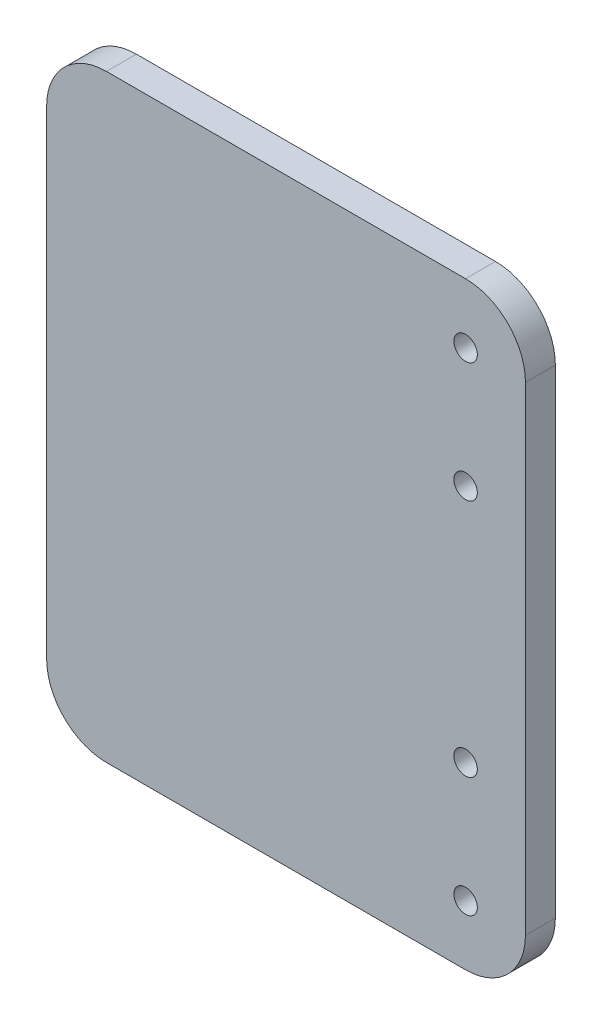
ISO-10303-21;
HEADER;
FILE_DESCRIPTION(('STEP AP214'),'2;1');
FILE_NAME('part.step','',(''),(''),'','','');
FILE_SCHEMA(('AUTOMOTIVE_DESIGN { 1 0 10303 214 1 1 1 1 }'));
ENDSEC;
DATA;
#1=APPLICATION_CONTEXT('core data for automotive mechanical design processes');
#2=APPLICATION_PROTOCOL_DEFINITION('international standard','automotive_design',2000,#1);
#3=PRODUCT_CONTEXT('',#1,'mechanical');
#4=PRODUCT('Part','Part','',(#3));
#5=PRODUCT_RELATED_PRODUCT_CATEGORY('part','',(#4));
#6=PRODUCT_DEFINITION_FORMATION('','',#4);
#7=PRODUCT_DEFINITION_CONTEXT('part definition',#1,'design');
#8=PRODUCT_DEFINITION('design','',#6,#7);
#9=PRODUCT_DEFINITION_SHAPE('','',#8);
#10=(LENGTH_UNIT() NAMED_UNIT(*) SI_UNIT(.MILLI.,.METRE.));
#11=(NAMED_UNIT(*) PLANE_ANGLE_UNIT() SI_UNIT($,.RADIAN.));
#12=(NAMED_UNIT(*) SI_UNIT($,.STERADIAN.) SOLID_ANGLE_UNIT());
#13=UNCERTAINTY_MEASURE_WITH_UNIT(LENGTH_MEASURE(1.E-05),#10,'distance_accuracy_value','');
#14=(GEOMETRIC_REPRESENTATION_CONTEXT(3) GLOBAL_UNCERTAINTY_ASSIGNED_CONTEXT((#13)) GLOBAL_UNIT_ASSIGNED_CONTEXT((#10,
#11,#12)) REPRESENTATION_CONTEXT('',''));
#15=CARTESIAN_POINT('',(0.,0.,0.));
#16=DIRECTION('',(0.,0.,1.));
#17=DIRECTION('',(1.,0.,0.));
#18=AXIS2_PLACEMENT_3D('',#15,#16,#17);
#19=CARTESIAN_POINT('',(50.8,63.5,6.35));
#20=DIRECTION('',(0.,-1.,0.));
#21=DIRECTION('',(0.,0.,-1.));
#22=AXIS2_PLACEMENT_3D('',#19,#20,#21);
#23=PLANE('',#22);
#24=DIRECTION('',(-1.,0.,0.));
#25=VECTOR('',#24,1.);
#26=CARTESIAN_POINT('',(50.8,63.5,6.35));
#27=LINE('',#26,#25);
#28=CARTESIAN_POINT('',(38.1,63.5,6.35));
#29=VERTEX_POINT('',#28);
#30=CARTESIAN_POINT('',(-38.1,63.5,6.35));
#31=VERTEX_POINT('',#30);
#32=EDGE_CURVE('E146',#29,#31,#27,.T.);
#33=ORIENTED_EDGE('',*,*,#32,.F.);
#34=DIRECTION('',(0.,0.,-1.));
#35=VECTOR('',#34,1.);
#36=CARTESIAN_POINT('',(38.1,63.5,6.35));
#37=LINE('',#36,#35);
#38=CARTESIAN_POINT('',(38.1,63.5,0.));
#39=VERTEX_POINT('',#38);
#40=EDGE_CURVE('E11',#29,#39,#37,.T.);
#41=ORIENTED_EDGE('',*,*,#40,.T.);
#42=DIRECTION('',(-1.,0.,0.));
#43=VECTOR('',#42,1.);
#44=CARTESIAN_POINT('',(50.8,63.5,0.));
#45=LINE('',#44,#43);
#46=CARTESIAN_POINT('',(-38.1,63.5,0.));
#47=VERTEX_POINT('',#46);
#48=EDGE_CURVE('E148',#39,#47,#45,.T.);
#49=ORIENTED_EDGE('',*,*,#48,.T.);
#50=DIRECTION('',(0.,0.,-1.));
#51=VECTOR('',#50,1.);
#52=CARTESIAN_POINT('',(-38.1,63.5,6.35));
#53=LINE('',#52,#51);
#54=EDGE_CURVE('E54',#47,#31,#53,.F.);
#55=ORIENTED_EDGE('',*,*,#54,.T.);
#56=EDGE_LOOP('',(#33,#41,#49,#55));
#57=FACE_BOUND('',#56,.T.);
#58=ADVANCED_FACE('F45',(#57),#23,.F.);
#59=CARTESIAN_POINT('',(-50.8,-63.5,6.35));
#60=DIRECTION('',(1.,0.,0.));
#61=DIRECTION('',(0.,0.,-1.));
#62=AXIS2_PLACEMENT_3D('',#59,#60,#61);
#63=PLANE('',#62);
#64=DIRECTION('',(0.,-1.,0.));
#65=VECTOR('',#64,1.);
#66=CARTESIAN_POINT('',(-50.8,-63.5,0.));
#67=LINE('',#66,#65);
#68=CARTESIAN_POINT('',(-50.8,50.8,0.));
#69=VERTEX_POINT('',#68);
#70=CARTESIAN_POINT('',(-50.8,-50.8,0.));
#71=VERTEX_POINT('',#70);
#72=EDGE_CURVE('E142',#69,#71,#67,.T.);
#73=ORIENTED_EDGE('',*,*,#72,.T.);
#74=DIRECTION('',(0.,0.,-1.));
#75=VECTOR('',#74,1.);
#76=CARTESIAN_POINT('',(-50.8,-50.8,6.35));
#77=LINE('',#76,#75);
#78=CARTESIAN_POINT('',(-50.8,-50.8,6.35));
#79=VERTEX_POINT('',#78);
#80=EDGE_CURVE('E118',#71,#79,#77,.F.);
#81=ORIENTED_EDGE('',*,*,#80,.T.);
#82=DIRECTION('',(0.,-1.,0.));
#83=VECTOR('',#82,1.);
#84=CARTESIAN_POINT('',(-50.8,-63.5,6.35));
#85=LINE('',#84,#83);
#86=CARTESIAN_POINT('',(-50.8,50.8,6.35));
#87=VERTEX_POINT('',#86);
#88=EDGE_CURVE('E198',#87,#79,#85,.T.);
#89=ORIENTED_EDGE('',*,*,#88,.F.);
#90=DIRECTION('',(0.,0.,-1.));
#91=VECTOR('',#90,1.);
#92=CARTESIAN_POINT('',(-50.8,50.8,6.35));
#93=LINE('',#92,#91);
#94=EDGE_CURVE('E124',#87,#69,#93,.T.);
#95=ORIENTED_EDGE('',*,*,#94,.T.);
#96=EDGE_LOOP('',(#73,#81,#89,#95));
#97=FACE_BOUND('',#96,.T.);
#98=ADVANCED_FACE('F202',(#97),#63,.F.);
#99=CARTESIAN_POINT('',(50.8,-63.5,6.35));
#100=DIRECTION('',(0.,1.,0.));
#101=DIRECTION('',(0.,0.,1.));
#102=AXIS2_PLACEMENT_3D('',#99,#100,#101);
#103=PLANE('',#102);
#104=DIRECTION('',(1.,0.,0.));
#105=VECTOR('',#104,1.);
#106=CARTESIAN_POINT('',(50.8,-63.5,6.35));
#107=LINE('',#106,#105);
#108=CARTESIAN_POINT('',(-38.1,-63.5,6.35));
#109=VERTEX_POINT('',#108);
#110=CARTESIAN_POINT('',(38.1,-63.5,6.35));
#111=VERTEX_POINT('',#110);
#112=EDGE_CURVE('E133',#109,#111,#107,.T.);
#113=ORIENTED_EDGE('',*,*,#112,.F.);
#114=DIRECTION('',(0.,0.,-1.));
#115=VECTOR('',#114,1.);
#116=CARTESIAN_POINT('',(-38.1,-63.5,6.35));
#117=LINE('',#116,#115);
#118=CARTESIAN_POINT('',(-38.1,-63.5,0.));
#119=VERTEX_POINT('',#118);
#120=EDGE_CURVE('E117',#109,#119,#117,.T.);
#121=ORIENTED_EDGE('',*,*,#120,.T.);
#122=DIRECTION('',(1.,0.,0.));
#123=VECTOR('',#122,1.);
#124=CARTESIAN_POINT('',(50.8,-63.5,0.));
#125=LINE('',#124,#123);
#126=CARTESIAN_POINT('',(38.1,-63.5,0.));
#127=VERTEX_POINT('',#126);
#128=EDGE_CURVE('E131',#119,#127,#125,.T.);
#129=ORIENTED_EDGE('',*,*,#128,.T.);
#130=DIRECTION('',(0.,0.,-1.));
#131=VECTOR('',#130,1.);
#132=CARTESIAN_POINT('',(38.1,-63.5,6.35));
#133=LINE('',#132,#131);
#134=EDGE_CURVE('E136',#127,#111,#133,.F.);
#135=ORIENTED_EDGE('',*,*,#134,.T.);
#136=EDGE_LOOP('',(#113,#121,#129,#135));
#137=FACE_BOUND('',#136,.T.);
#138=ADVANCED_FACE('F130',(#137),#103,.F.);
#139=CARTESIAN_POINT('',(50.8,-63.5,6.35));
#140=DIRECTION('',(-1.,0.,0.));
#141=DIRECTION('',(0.,0.,1.));
#142=AXIS2_PLACEMENT_3D('',#139,#140,#141);
#143=PLANE('',#142);
#144=DIRECTION('',(0.,1.,0.));
#145=VECTOR('',#144,1.);
#146=CARTESIAN_POINT('',(50.8,-63.5,6.35));
#147=LINE('',#146,#145);
#148=CARTESIAN_POINT('',(50.8,-50.8,6.35));
#149=VERTEX_POINT('',#148);
#150=CARTESIAN_POINT('',(50.8,50.8,6.35));
#151=VERTEX_POINT('',#150);
#152=EDGE_CURVE('E153',#149,#151,#147,.T.);
#153=ORIENTED_EDGE('',*,*,#152,.F.);
#154=DIRECTION('',(0.,0.,-1.));
#155=VECTOR('',#154,1.);
#156=CARTESIAN_POINT('',(50.8,-50.8,6.35));
#157=LINE('',#156,#155);
#158=CARTESIAN_POINT('',(50.8,-50.8,0.));
#159=VERTEX_POINT('',#158);
#160=EDGE_CURVE('E180',#149,#159,#157,.T.);
#161=ORIENTED_EDGE('',*,*,#160,.T.);
#162=DIRECTION('',(0.,1.,0.));
#163=VECTOR('',#162,1.);
#164=CARTESIAN_POINT('',(50.8,-63.5,0.));
#165=LINE('',#164,#163);
#166=CARTESIAN_POINT('',(50.8,50.8,0.));
#167=VERTEX_POINT('',#166);
#168=EDGE_CURVE('E141',#159,#167,#165,.T.);
#169=ORIENTED_EDGE('',*,*,#168,.T.);
#170=DIRECTION('',(0.,0.,-1.));
#171=VECTOR('',#170,1.);
#172=CARTESIAN_POINT('',(50.8,50.8,6.35));
#173=LINE('',#172,#171);
#174=EDGE_CURVE('E61',#167,#151,#173,.F.);
#175=ORIENTED_EDGE('',*,*,#174,.T.);
#176=EDGE_LOOP('',(#153,#161,#169,#175));
#177=FACE_BOUND('',#176,.T.);
#178=ADVANCED_FACE('F248',(#177),#143,.F.);
#179=CARTESIAN_POINT('',(0.,0.,6.35));
#180=DIRECTION('',(0.,0.,-1.));
#181=DIRECTION('',(-1.,0.,0.));
#182=AXIS2_PLACEMENT_3D('',#179,#180,#181);
#183=PLANE('',#182);
#184=CARTESIAN_POINT('',(38.1,-50.8,6.35));
#185=DIRECTION('',(0.,0.,1.));
#186=DIRECTION('',(1.,0.,0.));
#187=AXIS2_PLACEMENT_3D('',#184,#185,#186);
#188=CIRCLE('',#187,2.48919999999999);
#189=CARTESIAN_POINT('',(40.5892,-50.8,6.35));
#190=VERTEX_POINT('',#189);
#191=EDGE_CURVE('E239',#190,#190,#188,.T.);
#192=ORIENTED_EDGE('',*,*,#191,.F.);
#193=EDGE_LOOP('',(#192));
#194=FACE_BOUND('',#193,.T.);
#195=CARTESIAN_POINT('',(38.1,-25.4,6.35));
#196=DIRECTION('',(0.,0.,1.));
#197=DIRECTION('',(1.,0.,0.));
#198=AXIS2_PLACEMENT_3D('',#195,#196,#197);
#199=CIRCLE('',#198,2.48919999999999);
#200=CARTESIAN_POINT('',(40.5892,-25.4,6.35));
#201=VERTEX_POINT('',#200);
#202=EDGE_CURVE('E231',#201,#201,#199,.T.);
#203=ORIENTED_EDGE('',*,*,#202,.F.);
#204=EDGE_LOOP('',(#203));
#205=FACE_BOUND('',#204,.T.);
#206=CARTESIAN_POINT('',(38.1,25.4,6.35));
#207=DIRECTION('',(0.,0.,1.));
#208=DIRECTION('',(1.,0.,0.));
#209=AXIS2_PLACEMENT_3D('',#206,#207,#208);
#210=CIRCLE('',#209,2.48919999999999);
#211=CARTESIAN_POINT('',(40.5892,25.4,6.35));
#212=VERTEX_POINT('',#211);
#213=EDGE_CURVE('E223',#212,#212,#210,.T.);
#214=ORIENTED_EDGE('',*,*,#213,.F.);
#215=EDGE_LOOP('',(#214));
#216=FACE_BOUND('',#215,.T.);
#217=CARTESIAN_POINT('',(38.1,50.8,6.35));
#218=DIRECTION('',(0.,0.,1.));
#219=DIRECTION('',(1.,0.,0.));
#220=AXIS2_PLACEMENT_3D('',#217,#218,#219);
#221=CIRCLE('',#220,2.48919999999999);
#222=CARTESIAN_POINT('',(40.5892,50.8,6.35));
#223=VERTEX_POINT('',#222);
#224=EDGE_CURVE('E207',#223,#223,#221,.T.);
#225=ORIENTED_EDGE('',*,*,#224,.F.);
#226=EDGE_LOOP('',(#225));
#227=FACE_BOUND('',#226,.T.);
#228=ORIENTED_EDGE('',*,*,#88,.T.);
#229=CARTESIAN_POINT('',(-38.1,-50.8,6.35));
#230=DIRECTION('',(0.,0.,-1.));
#231=DIRECTION('',(-1.,0.,0.));
#232=AXIS2_PLACEMENT_3D('',#229,#230,#231);
#233=CIRCLE('',#232,12.7);
#234=EDGE_CURVE('E175',#79,#109,#233,.F.);
#235=ORIENTED_EDGE('',*,*,#234,.T.);
#236=ORIENTED_EDGE('',*,*,#112,.T.);
#237=CARTESIAN_POINT('',(38.1,-50.8,6.35));
#238=DIRECTION('',(0.,0.,-1.));
#239=DIRECTION('',(-1.,0.,0.));
#240=AXIS2_PLACEMENT_3D('',#237,#238,#239);
#241=CIRCLE('',#240,12.7);
#242=EDGE_CURVE('E68',#111,#149,#241,.F.);
#243=ORIENTED_EDGE('',*,*,#242,.T.);
#244=ORIENTED_EDGE('',*,*,#152,.T.);
#245=CARTESIAN_POINT('',(38.1,50.8,6.35));
#246=DIRECTION('',(0.,0.,-1.));
#247=DIRECTION('',(-1.,0.,0.));
#248=AXIS2_PLACEMENT_3D('',#245,#246,#247);
#249=CIRCLE('',#248,12.7);
#250=EDGE_CURVE('E170',#151,#29,#249,.F.);
#251=ORIENTED_EDGE('',*,*,#250,.T.);
#252=ORIENTED_EDGE('',*,*,#32,.T.);
#253=CARTESIAN_POINT('',(-38.1,50.8,6.35));
#254=DIRECTION('',(0.,0.,-1.));
#255=DIRECTION('',(-1.,0.,0.));
#256=AXIS2_PLACEMENT_3D('',#253,#254,#255);
#257=CIRCLE('',#256,12.7);
#258=EDGE_CURVE('E167',#31,#87,#257,.F.);
#259=ORIENTED_EDGE('',*,*,#258,.T.);
#260=EDGE_LOOP('',(#228,#235,#236,#243,#244,#251,#252,#259));
#261=FACE_BOUND('',#260,.T.);
#262=ADVANCED_FACE('F194',(#194,#205,#216,#227,#261),#183,.F.);
#263=CARTESIAN_POINT('',(0.,0.,0.));
#264=DIRECTION('',(0.,0.,-1.));
#265=DIRECTION('',(-1.,0.,0.));
#266=AXIS2_PLACEMENT_3D('',#263,#264,#265);
#267=PLANE('',#266);
#268=CARTESIAN_POINT('',(38.1,-50.8,0.));
#269=DIRECTION('',(0.,0.,1.));
#270=DIRECTION('',(1.,0.,0.));
#271=AXIS2_PLACEMENT_3D('',#268,#269,#270);
#272=CIRCLE('',#271,2.48919999999999);
#273=CARTESIAN_POINT('',(40.5892,-50.8,0.));
#274=VERTEX_POINT('',#273);
#275=EDGE_CURVE('E235',#274,#274,#272,.T.);
#276=ORIENTED_EDGE('',*,*,#275,.T.);
#277=EDGE_LOOP('',(#276));
#278=FACE_BOUND('',#277,.T.);
#279=CARTESIAN_POINT('',(38.1,-25.4,0.));
#280=DIRECTION('',(0.,0.,1.));
#281=DIRECTION('',(1.,0.,0.));
#282=AXIS2_PLACEMENT_3D('',#279,#280,#281);
#283=CIRCLE('',#282,2.48919999999999);
#284=CARTESIAN_POINT('',(40.5892,-25.4,0.));
#285=VERTEX_POINT('',#284);
#286=EDGE_CURVE('E227',#285,#285,#283,.T.);
#287=ORIENTED_EDGE('',*,*,#286,.T.);
#288=EDGE_LOOP('',(#287));
#289=FACE_BOUND('',#288,.T.);
#290=CARTESIAN_POINT('',(38.1,25.4,0.));
#291=DIRECTION('',(0.,0.,1.));
#292=DIRECTION('',(1.,0.,0.));
#293=AXIS2_PLACEMENT_3D('',#290,#291,#292);
#294=CIRCLE('',#293,2.48919999999999);
#295=CARTESIAN_POINT('',(40.5892,25.4,0.));
#296=VERTEX_POINT('',#295);
#297=EDGE_CURVE('E219',#296,#296,#294,.T.);
#298=ORIENTED_EDGE('',*,*,#297,.T.);
#299=EDGE_LOOP('',(#298));
#300=FACE_BOUND('',#299,.T.);
#301=CARTESIAN_POINT('',(38.1,50.8,0.));
#302=DIRECTION('',(0.,0.,1.));
#303=DIRECTION('',(1.,0.,0.));
#304=AXIS2_PLACEMENT_3D('',#301,#302,#303);
#305=CIRCLE('',#304,2.48919999999999);
#306=CARTESIAN_POINT('',(40.5892,50.8,0.));
#307=VERTEX_POINT('',#306);
#308=EDGE_CURVE('E204',#307,#307,#305,.T.);
#309=ORIENTED_EDGE('',*,*,#308,.T.);
#310=EDGE_LOOP('',(#309));
#311=FACE_BOUND('',#310,.T.);
#312=ORIENTED_EDGE('',*,*,#128,.F.);
#313=CARTESIAN_POINT('',(-38.1,-50.8,0.));
#314=DIRECTION('',(0.,0.,-1.));
#315=DIRECTION('',(-1.,0.,0.));
#316=AXIS2_PLACEMENT_3D('',#313,#314,#315);
#317=CIRCLE('',#316,12.7);
#318=EDGE_CURVE('E113',#119,#71,#317,.T.);
#319=ORIENTED_EDGE('',*,*,#318,.T.);
#320=ORIENTED_EDGE('',*,*,#72,.F.);
#321=CARTESIAN_POINT('',(-38.1,50.8,0.));
#322=DIRECTION('',(0.,0.,-1.));
#323=DIRECTION('',(-1.,0.,0.));
#324=AXIS2_PLACEMENT_3D('',#321,#322,#323);
#325=CIRCLE('',#324,12.7);
#326=EDGE_CURVE('E135',#69,#47,#325,.T.);
#327=ORIENTED_EDGE('',*,*,#326,.T.);
#328=ORIENTED_EDGE('',*,*,#48,.F.);
#329=CARTESIAN_POINT('',(38.1,50.8,0.));
#330=DIRECTION('',(0.,0.,-1.));
#331=DIRECTION('',(-1.,0.,0.));
#332=AXIS2_PLACEMENT_3D('',#329,#330,#331);
#333=CIRCLE('',#332,12.7);
#334=EDGE_CURVE('E157',#39,#167,#333,.T.);
#335=ORIENTED_EDGE('',*,*,#334,.T.);
#336=ORIENTED_EDGE('',*,*,#168,.F.);
#337=CARTESIAN_POINT('',(38.1,-50.8,0.));
#338=DIRECTION('',(0.,0.,-1.));
#339=DIRECTION('',(-1.,0.,0.));
#340=AXIS2_PLACEMENT_3D('',#337,#338,#339);
#341=CIRCLE('',#340,12.7);
#342=EDGE_CURVE('E125',#159,#127,#341,.T.);
#343=ORIENTED_EDGE('',*,*,#342,.T.);
#344=EDGE_LOOP('',(#312,#319,#320,#327,#328,#335,#336,#343));
#345=FACE_BOUND('',#344,.T.);
#346=ADVANCED_FACE('F138',(#278,#289,#300,#311,#345),#267,.T.);
#347=CARTESIAN_POINT('',(38.1,50.8,6.35));
#348=DIRECTION('',(0.,0.,1.));
#349=DIRECTION('',(1.,0.,0.));
#350=AXIS2_PLACEMENT_3D('',#347,#348,#349);
#351=CYLINDRICAL_SURFACE('',#350,2.48919999999999);
#352=ORIENTED_EDGE('',*,*,#308,.F.);
#353=EDGE_LOOP('',(#352));
#354=FACE_BOUND('',#353,.T.);
#355=ORIENTED_EDGE('',*,*,#224,.T.);
#356=EDGE_LOOP('',(#355));
#357=FACE_BOUND('',#356,.T.);
#358=ADVANCED_FACE('F256',(#354,#357),#351,.F.);
#359=CARTESIAN_POINT('',(38.1,25.4,6.35));
#360=DIRECTION('',(0.,0.,1.));
#361=DIRECTION('',(1.,0.,0.));
#362=AXIS2_PLACEMENT_3D('',#359,#360,#361);
#363=CYLINDRICAL_SURFACE('',#362,2.48919999999999);
#364=ORIENTED_EDGE('',*,*,#297,.F.);
#365=EDGE_LOOP('',(#364));
#366=FACE_BOUND('',#365,.T.);
#367=ORIENTED_EDGE('',*,*,#213,.T.);
#368=EDGE_LOOP('',(#367));
#369=FACE_BOUND('',#368,.T.);
#370=ADVANCED_FACE('F258',(#366,#369),#363,.F.);
#371=CARTESIAN_POINT('',(38.1,-25.4,6.35));
#372=DIRECTION('',(0.,0.,1.));
#373=DIRECTION('',(1.,0.,0.));
#374=AXIS2_PLACEMENT_3D('',#371,#372,#373);
#375=CYLINDRICAL_SURFACE('',#374,2.48919999999999);
#376=ORIENTED_EDGE('',*,*,#286,.F.);
#377=EDGE_LOOP('',(#376));
#378=FACE_BOUND('',#377,.T.);
#379=ORIENTED_EDGE('',*,*,#202,.T.);
#380=EDGE_LOOP('',(#379));
#381=FACE_BOUND('',#380,.T.);
#382=ADVANCED_FACE('F264',(#378,#381),#375,.F.);
#383=CARTESIAN_POINT('',(38.1,-50.8,6.35));
#384=DIRECTION('',(0.,0.,1.));
#385=DIRECTION('',(1.,0.,0.));
#386=AXIS2_PLACEMENT_3D('',#383,#384,#385);
#387=CYLINDRICAL_SURFACE('',#386,2.48919999999999);
#388=ORIENTED_EDGE('',*,*,#275,.F.);
#389=EDGE_LOOP('',(#388));
#390=FACE_BOUND('',#389,.T.);
#391=ORIENTED_EDGE('',*,*,#191,.T.);
#392=EDGE_LOOP('',(#391));
#393=FACE_BOUND('',#392,.T.);
#394=ADVANCED_FACE('F244',(#390,#393),#387,.F.);
#395=CARTESIAN_POINT('',(-38.1,-50.8,6.35));
#396=DIRECTION('',(0.,0.,-1.));
#397=DIRECTION('',(-1.,0.,0.));
#398=AXIS2_PLACEMENT_3D('',#395,#396,#397);
#399=CYLINDRICAL_SURFACE('',#398,12.7);
#400=ORIENTED_EDGE('',*,*,#234,.F.);
#401=ORIENTED_EDGE('',*,*,#80,.F.);
#402=ORIENTED_EDGE('',*,*,#318,.F.);
#403=ORIENTED_EDGE('',*,*,#120,.F.);
#404=EDGE_LOOP('',(#400,#401,#402,#403));
#405=FACE_BOUND('',#404,.T.);
#406=ADVANCED_FACE('F116',(#405),#399,.T.);
#407=CARTESIAN_POINT('',(38.1,-50.8,6.35));
#408=DIRECTION('',(0.,0.,-1.));
#409=DIRECTION('',(-1.,0.,0.));
#410=AXIS2_PLACEMENT_3D('',#407,#408,#409);
#411=CYLINDRICAL_SURFACE('',#410,12.7);
#412=ORIENTED_EDGE('',*,*,#242,.F.);
#413=ORIENTED_EDGE('',*,*,#134,.F.);
#414=ORIENTED_EDGE('',*,*,#342,.F.);
#415=ORIENTED_EDGE('',*,*,#160,.F.);
#416=EDGE_LOOP('',(#412,#413,#414,#415));
#417=FACE_BOUND('',#416,.T.);
#418=ADVANCED_FACE('F282',(#417),#411,.T.);
#419=CARTESIAN_POINT('',(38.1,50.8,6.35));
#420=DIRECTION('',(0.,0.,-1.));
#421=DIRECTION('',(-1.,0.,0.));
#422=AXIS2_PLACEMENT_3D('',#419,#420,#421);
#423=CYLINDRICAL_SURFACE('',#422,12.7);
#424=ORIENTED_EDGE('',*,*,#250,.F.);
#425=ORIENTED_EDGE('',*,*,#174,.F.);
#426=ORIENTED_EDGE('',*,*,#334,.F.);
#427=ORIENTED_EDGE('',*,*,#40,.F.);
#428=EDGE_LOOP('',(#424,#425,#426,#427));
#429=FACE_BOUND('',#428,.T.);
#430=ADVANCED_FACE('F284',(#429),#423,.T.);
#431=CARTESIAN_POINT('',(-38.1,50.8,6.35));
#432=DIRECTION('',(0.,0.,-1.));
#433=DIRECTION('',(-1.,0.,0.));
#434=AXIS2_PLACEMENT_3D('',#431,#432,#433);
#435=CYLINDRICAL_SURFACE('',#434,12.7);
#436=ORIENTED_EDGE('',*,*,#258,.F.);
#437=ORIENTED_EDGE('',*,*,#54,.F.);
#438=ORIENTED_EDGE('',*,*,#326,.F.);
#439=ORIENTED_EDGE('',*,*,#94,.F.);
#440=EDGE_LOOP('',(#436,#437,#438,#439));
#441=FACE_BOUND('',#440,.T.);
#442=ADVANCED_FACE('F47',(#441),#435,.T.);
#443=CLOSED_SHELL('',(#58,#98,#138,#178,#262,#346,#358,#370,#382,#394,#406,#418,#430,#442));
#444=MANIFOLD_SOLID_BREP('B2',#443);
#445=ADVANCED_BREP_SHAPE_REPRESENTATION('',(#18,#444),#14);
#446=SHAPE_DEFINITION_REPRESENTATION(#9,#445);
ENDSEC;
END-ISO-10303-21;
